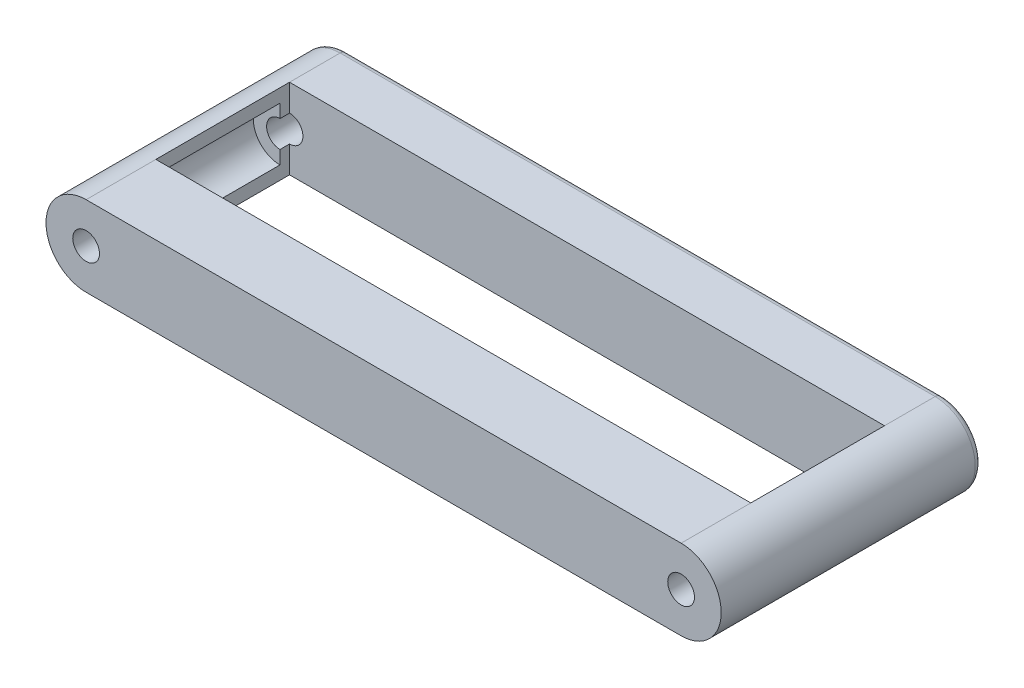
ISO-10303-21;
HEADER;
FILE_DESCRIPTION(('STEP AP214'),'2;1');
FILE_NAME('part.step','',(''),(''),'','','');
FILE_SCHEMA(('AUTOMOTIVE_DESIGN { 1 0 10303 214 1 1 1 1 }'));
ENDSEC;
DATA;
#1=APPLICATION_CONTEXT('core data for automotive mechanical design processes');
#2=APPLICATION_PROTOCOL_DEFINITION('international standard','automotive_design',2000,#1);
#3=PRODUCT_CONTEXT('',#1,'mechanical');
#4=PRODUCT('Part','Part','',(#3));
#5=PRODUCT_RELATED_PRODUCT_CATEGORY('part','',(#4));
#6=PRODUCT_DEFINITION_FORMATION('','',#4);
#7=PRODUCT_DEFINITION_CONTEXT('part definition',#1,'design');
#8=PRODUCT_DEFINITION('design','',#6,#7);
#9=PRODUCT_DEFINITION_SHAPE('','',#8);
#10=(LENGTH_UNIT() NAMED_UNIT(*) SI_UNIT(.MILLI.,.METRE.));
#11=(NAMED_UNIT(*) PLANE_ANGLE_UNIT() SI_UNIT($,.RADIAN.));
#12=(NAMED_UNIT(*) SI_UNIT($,.STERADIAN.) SOLID_ANGLE_UNIT());
#13=UNCERTAINTY_MEASURE_WITH_UNIT(LENGTH_MEASURE(1.E-05),#10,'distance_accuracy_value','');
#14=(GEOMETRIC_REPRESENTATION_CONTEXT(3) GLOBAL_UNCERTAINTY_ASSIGNED_CONTEXT((#13)) GLOBAL_UNIT_ASSIGNED_CONTEXT((#10,
#11,#12)) REPRESENTATION_CONTEXT('',''));
#15=CARTESIAN_POINT('',(0.,0.,0.));
#16=DIRECTION('',(0.,0.,1.));
#17=DIRECTION('',(1.,0.,0.));
#18=AXIS2_PLACEMENT_3D('',#15,#16,#17);
#19=CARTESIAN_POINT('',(-44.5,0.,39.));
#20=DIRECTION('',(0.,0.,-1.));
#21=DIRECTION('',(-1.,0.,0.));
#22=AXIS2_PLACEMENT_3D('',#19,#20,#21);
#23=CYLINDRICAL_SURFACE('',#22,2.);
#24=CARTESIAN_POINT('',(-44.5,0.,39.));
#25=DIRECTION('',(0.,0.,1.));
#26=DIRECTION('',(1.,0.,0.));
#27=AXIS2_PLACEMENT_3D('',#24,#25,#26);
#28=CIRCLE('',#27,2.);
#29=CARTESIAN_POINT('',(-42.5,0.,39.));
#30=VERTEX_POINT('',#29);
#31=EDGE_CURVE('E270',#30,#30,#28,.T.);
#32=ORIENTED_EDGE('',*,*,#31,.T.);
#33=EDGE_LOOP('',(#32));
#34=FACE_BOUND('',#33,.T.);
#35=CARTESIAN_POINT('',(-44.5,0.,34.));
#36=DIRECTION('',(0.,0.,-1.));
#37=DIRECTION('',(-1.,0.,0.));
#38=AXIS2_PLACEMENT_3D('',#35,#36,#37);
#39=CIRCLE('',#38,2.);
#40=CARTESIAN_POINT('',(-46.5,0.,34.));
#41=VERTEX_POINT('',#40);
#42=EDGE_CURVE('E220',#41,#41,#39,.T.);
#43=ORIENTED_EDGE('',*,*,#42,.T.);
#44=EDGE_LOOP('',(#43));
#45=FACE_BOUND('',#44,.T.);
#46=ADVANCED_FACE('F39',(#34,#45),#23,.F.);
#47=CARTESIAN_POINT('',(44.5,0.,39.));
#48=DIRECTION('',(0.,0.,-1.));
#49=DIRECTION('',(-1.,0.,0.));
#50=AXIS2_PLACEMENT_3D('',#47,#48,#49);
#51=CYLINDRICAL_SURFACE('',#50,2.);
#52=CARTESIAN_POINT('',(44.5,0.,1.));
#53=DIRECTION('',(0.,0.,1.));
#54=DIRECTION('',(1.,0.,0.));
#55=AXIS2_PLACEMENT_3D('',#52,#53,#54);
#56=CIRCLE('',#55,2.);
#57=CARTESIAN_POINT('',(46.5,0.,1.));
#58=VERTEX_POINT('',#57);
#59=EDGE_CURVE('E364',#58,#58,#56,.F.);
#60=ORIENTED_EDGE('',*,*,#59,.T.);
#61=EDGE_LOOP('',(#60));
#62=FACE_BOUND('',#61,.T.);
#63=DIRECTION('',(0.,0.,-1.));
#64=VECTOR('',#63,1.);
#65=CARTESIAN_POINT('',(44.5,-2.,39.));
#66=LINE('',#65,#64);
#67=CARTESIAN_POINT('',(44.5,-2.,10.));
#68=VERTEX_POINT('',#67);
#69=CARTESIAN_POINT('',(44.5,-2.,8.57164907619164));
#70=VERTEX_POINT('',#69);
#71=EDGE_CURVE('E311',#68,#70,#66,.T.);
#72=ORIENTED_EDGE('',*,*,#71,.F.);
#73=CARTESIAN_POINT('',(44.5,0.,10.));
#74=DIRECTION('',(0.,0.,1.));
#75=DIRECTION('',(1.,0.,0.));
#76=AXIS2_PLACEMENT_3D('',#73,#74,#75);
#77=CIRCLE('',#76,2.);
#78=CARTESIAN_POINT('',(44.5,2.,10.));
#79=VERTEX_POINT('',#78);
#80=EDGE_CURVE('E173',#68,#79,#77,.T.);
#81=ORIENTED_EDGE('',*,*,#80,.T.);
#82=DIRECTION('',(0.,0.,-1.));
#83=VECTOR('',#82,1.);
#84=CARTESIAN_POINT('',(44.5,2.,39.));
#85=LINE('',#84,#83);
#86=CARTESIAN_POINT('',(44.5,2.,8.57164907619164));
#87=VERTEX_POINT('',#86);
#88=EDGE_CURVE('E307',#87,#79,#85,.F.);
#89=ORIENTED_EDGE('',*,*,#88,.F.);
#90=CARTESIAN_POINT('',(44.5,0.,8.57164907619164));
#91=DIRECTION('',(0.,0.,-1.));
#92=DIRECTION('',(-1.,0.,0.));
#93=AXIS2_PLACEMENT_3D('',#90,#91,#92);
#94=CIRCLE('',#93,2.);
#95=EDGE_CURVE('E314',#70,#87,#94,.T.);
#96=ORIENTED_EDGE('',*,*,#95,.F.);
#97=EDGE_LOOP('',(#72,#81,#89,#96));
#98=FACE_BOUND('',#97,.T.);
#99=ADVANCED_FACE('F412',(#62,#98),#51,.F.);
#100=CARTESIAN_POINT('',(-44.5,-6.,39.));
#101=DIRECTION('',(0.,1.,0.));
#102=DIRECTION('',(0.,0.,1.));
#103=AXIS2_PLACEMENT_3D('',#100,#101,#102);
#104=PLANE('',#103);
#105=DIRECTION('',(0.,0.,-1.));
#106=VECTOR('',#105,1.);
#107=CARTESIAN_POINT('',(-44.5,-6.,39.));
#108=LINE('',#107,#106);
#109=CARTESIAN_POINT('',(-44.5,-6.,8.57164907619164));
#110=VERTEX_POINT('',#109);
#111=CARTESIAN_POINT('',(-44.5,-6.,1.));
#112=VERTEX_POINT('',#111);
#113=EDGE_CURVE('E302',#110,#112,#108,.T.);
#114=ORIENTED_EDGE('',*,*,#113,.T.);
#115=DIRECTION('',(1.,0.,0.));
#116=VECTOR('',#115,1.);
#117=CARTESIAN_POINT('',(-44.5,-6.,1.));
#118=LINE('',#117,#116);
#119=CARTESIAN_POINT('',(44.5,-6.,1.));
#120=VERTEX_POINT('',#119);
#121=EDGE_CURVE('E372',#112,#120,#118,.T.);
#122=ORIENTED_EDGE('',*,*,#121,.T.);
#123=DIRECTION('',(0.,0.,-1.));
#124=VECTOR('',#123,1.);
#125=CARTESIAN_POINT('',(44.5,-6.,39.));
#126=LINE('',#125,#124);
#127=CARTESIAN_POINT('',(44.5,-6.,8.57164907619164));
#128=VERTEX_POINT('',#127);
#129=EDGE_CURVE('E297',#128,#120,#126,.T.);
#130=ORIENTED_EDGE('',*,*,#129,.F.);
#131=DIRECTION('',(-1.,0.,0.));
#132=VECTOR('',#131,1.);
#133=CARTESIAN_POINT('',(-44.5,-6.,8.57164907619164));
#134=LINE('',#133,#132);
#135=EDGE_CURVE('E258',#128,#110,#134,.T.);
#136=ORIENTED_EDGE('',*,*,#135,.T.);
#137=EDGE_LOOP('',(#114,#122,#130,#136));
#138=FACE_BOUND('',#137,.T.);
#139=ADVANCED_FACE('F495',(#138),#104,.F.);
#140=CARTESIAN_POINT('',(-44.5,6.,39.));
#141=DIRECTION('',(0.,-1.,0.));
#142=DIRECTION('',(0.,0.,-1.));
#143=AXIS2_PLACEMENT_3D('',#140,#141,#142);
#144=PLANE('',#143);
#145=DIRECTION('',(0.,0.,-1.));
#146=VECTOR('',#145,1.);
#147=CARTESIAN_POINT('',(44.5,6.,39.));
#148=LINE('',#147,#146);
#149=CARTESIAN_POINT('',(44.5,6.,8.57164907619164));
#150=VERTEX_POINT('',#149);
#151=CARTESIAN_POINT('',(44.5,6.,1.));
#152=VERTEX_POINT('',#151);
#153=EDGE_CURVE('E292',#150,#152,#148,.T.);
#154=ORIENTED_EDGE('',*,*,#153,.T.);
#155=DIRECTION('',(-1.,0.,0.));
#156=VECTOR('',#155,1.);
#157=CARTESIAN_POINT('',(-44.5,6.,1.));
#158=LINE('',#157,#156);
#159=CARTESIAN_POINT('',(-44.5,6.,1.));
#160=VERTEX_POINT('',#159);
#161=EDGE_CURVE('E49',#152,#160,#158,.T.);
#162=ORIENTED_EDGE('',*,*,#161,.T.);
#163=DIRECTION('',(0.,0.,-1.));
#164=VECTOR('',#163,1.);
#165=CARTESIAN_POINT('',(-44.5,6.,39.));
#166=LINE('',#165,#164);
#167=CARTESIAN_POINT('',(-44.5,6.,8.57164907619164));
#168=VERTEX_POINT('',#167);
#169=EDGE_CURVE('E287',#168,#160,#166,.T.);
#170=ORIENTED_EDGE('',*,*,#169,.F.);
#171=DIRECTION('',(-1.,0.,0.));
#172=VECTOR('',#171,1.);
#173=CARTESIAN_POINT('',(-44.5,6.,8.57164907619164));
#174=LINE('',#173,#172);
#175=EDGE_CURVE('E228',#150,#168,#174,.T.);
#176=ORIENTED_EDGE('',*,*,#175,.F.);
#177=EDGE_LOOP('',(#154,#162,#170,#176));
#178=FACE_BOUND('',#177,.T.);
#179=ADVANCED_FACE('F509',(#178),#144,.F.);
#180=CARTESIAN_POINT('',(-44.5,0.,39.));
#181=DIRECTION('',(0.,0.,1.));
#182=DIRECTION('',(1.,0.,0.));
#183=AXIS2_PLACEMENT_3D('',#180,#181,#182);
#184=PLANE('',#183);
#185=ORIENTED_EDGE('',*,*,#31,.F.);
#186=EDGE_LOOP('',(#185));
#187=FACE_BOUND('',#186,.T.);
#188=CARTESIAN_POINT('',(-44.5,0.,39.));
#189=DIRECTION('',(0.,0.,1.));
#190=DIRECTION('',(1.,0.,0.));
#191=AXIS2_PLACEMENT_3D('',#188,#189,#190);
#192=CIRCLE('',#191,6.);
#193=CARTESIAN_POINT('',(-44.5,6.,39.));
#194=VERTEX_POINT('',#193);
#195=CARTESIAN_POINT('',(-44.5,-6.,39.));
#196=VERTEX_POINT('',#195);
#197=EDGE_CURVE('E274',#194,#196,#192,.T.);
#198=ORIENTED_EDGE('',*,*,#197,.T.);
#199=DIRECTION('',(1.,0.,0.));
#200=VECTOR('',#199,1.);
#201=CARTESIAN_POINT('',(-44.5,-6.,39.));
#202=LINE('',#201,#200);
#203=CARTESIAN_POINT('',(44.5,-6.,39.));
#204=VERTEX_POINT('',#203);
#205=EDGE_CURVE('E278',#196,#204,#202,.T.);
#206=ORIENTED_EDGE('',*,*,#205,.T.);
#207=CARTESIAN_POINT('',(44.5,0.,39.));
#208=DIRECTION('',(0.,0.,1.));
#209=DIRECTION('',(1.,0.,0.));
#210=AXIS2_PLACEMENT_3D('',#207,#208,#209);
#211=CIRCLE('',#210,6.);
#212=CARTESIAN_POINT('',(44.5,6.,39.));
#213=VERTEX_POINT('',#212);
#214=EDGE_CURVE('E281',#204,#213,#211,.T.);
#215=ORIENTED_EDGE('',*,*,#214,.T.);
#216=DIRECTION('',(-1.,0.,0.));
#217=VECTOR('',#216,1.);
#218=CARTESIAN_POINT('',(-44.5,6.,39.));
#219=LINE('',#218,#217);
#220=EDGE_CURVE('E284',#213,#194,#219,.T.);
#221=ORIENTED_EDGE('',*,*,#220,.T.);
#222=EDGE_LOOP('',(#198,#206,#215,#221));
#223=FACE_BOUND('',#222,.T.);
#224=CARTESIAN_POINT('',(44.5,0.,39.));
#225=DIRECTION('',(0.,0.,1.));
#226=DIRECTION('',(-1.,0.,0.));
#227=AXIS2_PLACEMENT_3D('',#224,#225,#226);
#228=CIRCLE('',#227,2.);
#229=CARTESIAN_POINT('',(42.5,0.,39.));
#230=VERTEX_POINT('',#229);
#231=EDGE_CURVE('E266',#230,#230,#228,.T.);
#232=ORIENTED_EDGE('',*,*,#231,.F.);
#233=EDGE_LOOP('',(#232));
#234=FACE_BOUND('',#233,.T.);
#235=ADVANCED_FACE('F450',(#187,#223,#234),#184,.T.);
#236=CARTESIAN_POINT('',(-44.5,0.,0.));
#237=DIRECTION('',(0.,0.,1.));
#238=DIRECTION('',(1.,0.,0.));
#239=AXIS2_PLACEMENT_3D('',#236,#237,#238);
#240=PLANE('',#239);
#241=CARTESIAN_POINT('',(44.5,0.,0.));
#242=DIRECTION('',(0.,0.,1.));
#243=DIRECTION('',(1.,0.,0.));
#244=AXIS2_PLACEMENT_3D('',#241,#242,#243);
#245=CIRCLE('',#244,3.);
#246=CARTESIAN_POINT('',(47.5,0.,0.));
#247=VERTEX_POINT('',#246);
#248=EDGE_CURVE('E360',#247,#247,#245,.T.);
#249=ORIENTED_EDGE('',*,*,#248,.T.);
#250=EDGE_LOOP('',(#249));
#251=FACE_BOUND('',#250,.T.);
#252=CARTESIAN_POINT('',(-44.5,0.,0.));
#253=DIRECTION('',(0.,0.,1.));
#254=DIRECTION('',(1.,0.,0.));
#255=AXIS2_PLACEMENT_3D('',#252,#253,#254);
#256=CIRCLE('',#255,3.);
#257=CARTESIAN_POINT('',(-41.5,0.,0.));
#258=VERTEX_POINT('',#257);
#259=EDGE_CURVE('E356',#258,#258,#256,.T.);
#260=ORIENTED_EDGE('',*,*,#259,.T.);
#261=EDGE_LOOP('',(#260));
#262=FACE_BOUND('',#261,.T.);
#263=CARTESIAN_POINT('',(44.5,0.,0.));
#264=DIRECTION('',(0.,0.,1.));
#265=DIRECTION('',(1.,0.,0.));
#266=AXIS2_PLACEMENT_3D('',#263,#264,#265);
#267=CIRCLE('',#266,5.);
#268=CARTESIAN_POINT('',(44.5,5.,0.));
#269=VERTEX_POINT('',#268);
#270=CARTESIAN_POINT('',(44.5,-5.,0.));
#271=VERTEX_POINT('',#270);
#272=EDGE_CURVE('E349',#269,#271,#267,.F.);
#273=ORIENTED_EDGE('',*,*,#272,.T.);
#274=DIRECTION('',(1.,0.,0.));
#275=VECTOR('',#274,1.);
#276=CARTESIAN_POINT('',(-44.5,-5.,0.));
#277=LINE('',#276,#275);
#278=CARTESIAN_POINT('',(-44.5,-5.,0.));
#279=VERTEX_POINT('',#278);
#280=EDGE_CURVE('E352',#271,#279,#277,.F.);
#281=ORIENTED_EDGE('',*,*,#280,.T.);
#282=CARTESIAN_POINT('',(-44.5,0.,0.));
#283=DIRECTION('',(0.,0.,1.));
#284=DIRECTION('',(1.,0.,0.));
#285=AXIS2_PLACEMENT_3D('',#282,#283,#284);
#286=CIRCLE('',#285,5.);
#287=CARTESIAN_POINT('',(-44.5,5.,0.));
#288=VERTEX_POINT('',#287);
#289=EDGE_CURVE('E337',#279,#288,#286,.F.);
#290=ORIENTED_EDGE('',*,*,#289,.T.);
#291=DIRECTION('',(-1.,0.,0.));
#292=VECTOR('',#291,1.);
#293=CARTESIAN_POINT('',(-44.5,5.,0.));
#294=LINE('',#293,#292);
#295=EDGE_CURVE('E346',#288,#269,#294,.F.);
#296=ORIENTED_EDGE('',*,*,#295,.T.);
#297=EDGE_LOOP('',(#273,#281,#290,#296));
#298=FACE_BOUND('',#297,.T.);
#299=ADVANCED_FACE('F518',(#251,#262,#298),#240,.F.);
#300=CARTESIAN_POINT('',(-44.5,0.,39.));
#301=DIRECTION('',(0.,0.,-1.));
#302=DIRECTION('',(-1.,0.,0.));
#303=AXIS2_PLACEMENT_3D('',#300,#301,#302);
#304=CYLINDRICAL_SURFACE('',#303,6.);
#305=ORIENTED_EDGE('',*,*,#169,.T.);
#306=CARTESIAN_POINT('',(-44.5,0.,1.));
#307=DIRECTION('',(0.,0.,1.));
#308=DIRECTION('',(1.,0.,0.));
#309=AXIS2_PLACEMENT_3D('',#306,#307,#308);
#310=CIRCLE('',#309,6.);
#311=EDGE_CURVE('E11',#160,#112,#310,.T.);
#312=ORIENTED_EDGE('',*,*,#311,.T.);
#313=ORIENTED_EDGE('',*,*,#113,.F.);
#314=DIRECTION('',(0.,0.,1.));
#315=VECTOR('',#314,1.);
#316=CARTESIAN_POINT('',(-44.5,-6.,39.));
#317=LINE('',#316,#315);
#318=CARTESIAN_POINT('',(-44.5,-6.,28.5716490761916));
#319=VERTEX_POINT('',#318);
#320=EDGE_CURVE('E262',#110,#319,#317,.T.);
#321=ORIENTED_EDGE('',*,*,#320,.T.);
#322=EDGE_CURVE('E303',#196,#319,#108,.T.);
#323=ORIENTED_EDGE('',*,*,#322,.F.);
#324=ORIENTED_EDGE('',*,*,#197,.F.);
#325=CARTESIAN_POINT('',(-44.5,6.,28.5716490761916));
#326=VERTEX_POINT('',#325);
#327=EDGE_CURVE('E288',#194,#326,#166,.T.);
#328=ORIENTED_EDGE('',*,*,#327,.T.);
#329=DIRECTION('',(0.,0.,1.));
#330=VECTOR('',#329,1.);
#331=CARTESIAN_POINT('',(-44.5,6.,8.57164907619164));
#332=LINE('',#331,#330);
#333=EDGE_CURVE('E215',#168,#326,#332,.T.);
#334=ORIENTED_EDGE('',*,*,#333,.F.);
#335=EDGE_LOOP('',(#305,#312,#313,#321,#323,#324,#328,#334));
#336=FACE_BOUND('',#335,.T.);
#337=ADVANCED_FACE('F442',(#336),#304,.T.);
#338=ORIENTED_EDGE('',*,*,#322,.T.);
#339=DIRECTION('',(1.,0.,0.));
#340=VECTOR('',#339,1.);
#341=CARTESIAN_POINT('',(-44.5,-6.,28.5716490761916));
#342=LINE('',#341,#340);
#343=CARTESIAN_POINT('',(44.5,-6.,28.5716490761916));
#344=VERTEX_POINT('',#343);
#345=EDGE_CURVE('E247',#319,#344,#342,.T.);
#346=ORIENTED_EDGE('',*,*,#345,.T.);
#347=EDGE_CURVE('E298',#204,#344,#126,.T.);
#348=ORIENTED_EDGE('',*,*,#347,.F.);
#349=ORIENTED_EDGE('',*,*,#205,.F.);
#350=EDGE_LOOP('',(#338,#346,#348,#349));
#351=FACE_BOUND('',#350,.T.);
#352=ADVANCED_FACE('F446',(#351),#104,.F.);
#353=CARTESIAN_POINT('',(44.5,0.,39.));
#354=DIRECTION('',(0.,0.,-1.));
#355=DIRECTION('',(-1.,0.,0.));
#356=AXIS2_PLACEMENT_3D('',#353,#354,#355);
#357=CYLINDRICAL_SURFACE('',#356,6.);
#358=ORIENTED_EDGE('',*,*,#129,.T.);
#359=CARTESIAN_POINT('',(44.5,0.,1.));
#360=DIRECTION('',(0.,0.,1.));
#361=DIRECTION('',(1.,0.,0.));
#362=AXIS2_PLACEMENT_3D('',#359,#360,#361);
#363=CIRCLE('',#362,6.);
#364=EDGE_CURVE('E64',#120,#152,#363,.T.);
#365=ORIENTED_EDGE('',*,*,#364,.T.);
#366=ORIENTED_EDGE('',*,*,#153,.F.);
#367=DIRECTION('',(0.,0.,-1.));
#368=VECTOR('',#367,1.);
#369=CARTESIAN_POINT('',(44.5,6.,8.57164907619164));
#370=LINE('',#369,#368);
#371=CARTESIAN_POINT('',(44.5,6.,28.5716490761916));
#372=VERTEX_POINT('',#371);
#373=EDGE_CURVE('E224',#372,#150,#370,.T.);
#374=ORIENTED_EDGE('',*,*,#373,.F.);
#375=EDGE_CURVE('E293',#213,#372,#148,.T.);
#376=ORIENTED_EDGE('',*,*,#375,.F.);
#377=ORIENTED_EDGE('',*,*,#214,.F.);
#378=ORIENTED_EDGE('',*,*,#347,.T.);
#379=DIRECTION('',(0.,0.,-1.));
#380=VECTOR('',#379,1.);
#381=CARTESIAN_POINT('',(44.5,-6.,39.));
#382=LINE('',#381,#380);
#383=EDGE_CURVE('E251',#344,#128,#382,.T.);
#384=ORIENTED_EDGE('',*,*,#383,.T.);
#385=EDGE_LOOP('',(#358,#365,#366,#374,#376,#377,#378,#384));
#386=FACE_BOUND('',#385,.T.);
#387=ADVANCED_FACE('F459',(#386),#357,.T.);
#388=ORIENTED_EDGE('',*,*,#375,.T.);
#389=DIRECTION('',(1.,0.,0.));
#390=VECTOR('',#389,1.);
#391=CARTESIAN_POINT('',(-44.5,6.,28.5716490761916));
#392=LINE('',#391,#390);
#393=EDGE_CURVE('E219',#326,#372,#392,.T.);
#394=ORIENTED_EDGE('',*,*,#393,.F.);
#395=ORIENTED_EDGE('',*,*,#327,.F.);
#396=ORIENTED_EDGE('',*,*,#220,.F.);
#397=EDGE_LOOP('',(#388,#394,#395,#396));
#398=FACE_BOUND('',#397,.T.);
#399=ADVANCED_FACE('F457',(#398),#144,.F.);
#400=CARTESIAN_POINT('',(-44.5,0.,1.));
#401=DIRECTION('',(0.,0.,1.));
#402=DIRECTION('',(1.,0.,0.));
#403=AXIS2_PLACEMENT_3D('',#400,#401,#402);
#404=CIRCLE('',#403,2.);
#405=CARTESIAN_POINT('',(-42.5,0.,1.));
#406=VERTEX_POINT('',#405);
#407=EDGE_CURVE('E368',#406,#406,#404,.F.);
#408=ORIENTED_EDGE('',*,*,#407,.T.);
#409=EDGE_LOOP('',(#408));
#410=FACE_BOUND('',#409,.T.);
#411=CARTESIAN_POINT('',(-44.5,0.,10.));
#412=DIRECTION('',(0.,0.,-1.));
#413=DIRECTION('',(-1.,0.,0.));
#414=AXIS2_PLACEMENT_3D('',#411,#412,#413);
#415=CIRCLE('',#414,2.);
#416=CARTESIAN_POINT('',(-44.5,-2.,10.));
#417=VERTEX_POINT('',#416);
#418=CARTESIAN_POINT('',(-44.5,2.,10.));
#419=VERTEX_POINT('',#418);
#420=EDGE_CURVE('E207',#417,#419,#415,.T.);
#421=ORIENTED_EDGE('',*,*,#420,.F.);
#422=DIRECTION('',(0.,0.,-1.));
#423=VECTOR('',#422,1.);
#424=CARTESIAN_POINT('',(-44.5,-2.,39.));
#425=LINE('',#424,#423);
#426=CARTESIAN_POINT('',(-44.5,-2.,8.57164907619164));
#427=VERTEX_POINT('',#426);
#428=EDGE_CURVE('E317',#427,#417,#425,.F.);
#429=ORIENTED_EDGE('',*,*,#428,.F.);
#430=CARTESIAN_POINT('',(-44.5,0.,8.57164907619164));
#431=DIRECTION('',(0.,0.,-1.));
#432=DIRECTION('',(-1.,0.,0.));
#433=AXIS2_PLACEMENT_3D('',#430,#431,#432);
#434=CIRCLE('',#433,2.);
#435=CARTESIAN_POINT('',(-44.5,2.,8.57164907619164));
#436=VERTEX_POINT('',#435);
#437=EDGE_CURVE('E255',#436,#427,#434,.T.);
#438=ORIENTED_EDGE('',*,*,#437,.F.);
#439=DIRECTION('',(0.,0.,-1.));
#440=VECTOR('',#439,1.);
#441=CARTESIAN_POINT('',(-44.5,2.,39.));
#442=LINE('',#441,#440);
#443=EDGE_CURVE('E321',#419,#436,#442,.T.);
#444=ORIENTED_EDGE('',*,*,#443,.F.);
#445=EDGE_LOOP('',(#421,#429,#438,#444));
#446=FACE_BOUND('',#445,.T.);
#447=ADVANCED_FACE('F467',(#410,#446),#23,.F.);
#448=CARTESIAN_POINT('',(44.5,0.,34.));
#449=DIRECTION('',(0.,0.,1.));
#450=DIRECTION('',(1.,0.,0.));
#451=AXIS2_PLACEMENT_3D('',#448,#449,#450);
#452=CIRCLE('',#451,2.);
#453=CARTESIAN_POINT('',(46.5,0.,34.));
#454=VERTEX_POINT('',#453);
#455=EDGE_CURVE('E214',#454,#454,#452,.T.);
#456=ORIENTED_EDGE('',*,*,#455,.F.);
#457=EDGE_LOOP('',(#456));
#458=FACE_BOUND('',#457,.T.);
#459=ORIENTED_EDGE('',*,*,#231,.T.);
#460=EDGE_LOOP('',(#459));
#461=FACE_BOUND('',#460,.T.);
#462=ADVANCED_FACE('F498',(#458,#461),#51,.F.);
#463=CARTESIAN_POINT('',(-44.5,-33.,8.57164907619164));
#464=DIRECTION('',(-1.,0.,0.));
#465=DIRECTION('',(0.,0.,1.));
#466=AXIS2_PLACEMENT_3D('',#463,#464,#465);
#467=PLANE('',#466);
#468=DIRECTION('',(0.,-1.,0.));
#469=VECTOR('',#468,1.);
#470=CARTESIAN_POINT('',(-44.5,-33.,10.));
#471=LINE('',#470,#469);
#472=CARTESIAN_POINT('',(-44.5,-4.00000000000001,10.));
#473=VERTEX_POINT('',#472);
#474=EDGE_CURVE('E210',#417,#473,#471,.T.);
#475=ORIENTED_EDGE('',*,*,#474,.T.);
#476=DIRECTION('',(0.,0.,1.));
#477=VECTOR('',#476,1.);
#478=CARTESIAN_POINT('',(-44.5,-4.00000000000001,10.));
#479=LINE('',#478,#477);
#480=CARTESIAN_POINT('',(-44.5,-4.00000000000001,28.5716490761916));
#481=VERTEX_POINT('',#480);
#482=EDGE_CURVE('E200',#473,#481,#479,.T.);
#483=ORIENTED_EDGE('',*,*,#482,.T.);
#484=DIRECTION('',(0.,1.,0.));
#485=VECTOR('',#484,1.);
#486=CARTESIAN_POINT('',(-44.5,-33.,28.5716490761916));
#487=LINE('',#486,#485);
#488=EDGE_CURVE('E244',#319,#481,#487,.T.);
#489=ORIENTED_EDGE('',*,*,#488,.F.);
#490=ORIENTED_EDGE('',*,*,#320,.F.);
#491=DIRECTION('',(0.,1.,0.));
#492=VECTOR('',#491,1.);
#493=CARTESIAN_POINT('',(-44.5,-33.,8.57164907619164));
#494=LINE('',#493,#492);
#495=EDGE_CURVE('E236',#110,#427,#494,.T.);
#496=ORIENTED_EDGE('',*,*,#495,.T.);
#497=ORIENTED_EDGE('',*,*,#428,.T.);
#498=EDGE_LOOP('',(#475,#483,#489,#490,#496,#497));
#499=FACE_BOUND('',#498,.T.);
#500=ADVANCED_FACE('F437',(#499),#467,.F.);
#501=CARTESIAN_POINT('',(-44.5,4.00000000000001,28.5716490761916));
#502=VERTEX_POINT('',#501);
#503=EDGE_CURVE('E232',#502,#326,#487,.T.);
#504=ORIENTED_EDGE('',*,*,#503,.F.);
#505=DIRECTION('',(0.,0.,1.));
#506=VECTOR('',#505,1.);
#507=CARTESIAN_POINT('',(-44.5,4.00000000000001,10.));
#508=LINE('',#507,#506);
#509=CARTESIAN_POINT('',(-44.5,4.00000000000001,10.));
#510=VERTEX_POINT('',#509);
#511=EDGE_CURVE('E195',#502,#510,#508,.F.);
#512=ORIENTED_EDGE('',*,*,#511,.T.);
#513=DIRECTION('',(0.,-1.,0.));
#514=VECTOR('',#513,1.);
#515=CARTESIAN_POINT('',(-44.5,-33.,10.));
#516=LINE('',#515,#514);
#517=EDGE_CURVE('E333',#510,#419,#516,.T.);
#518=ORIENTED_EDGE('',*,*,#517,.T.);
#519=ORIENTED_EDGE('',*,*,#443,.T.);
#520=EDGE_CURVE('E233',#436,#168,#494,.T.);
#521=ORIENTED_EDGE('',*,*,#520,.T.);
#522=ORIENTED_EDGE('',*,*,#333,.T.);
#523=EDGE_LOOP('',(#504,#512,#518,#519,#521,#522));
#524=FACE_BOUND('',#523,.T.);
#525=ADVANCED_FACE('F473',(#524),#467,.F.);
#526=CARTESIAN_POINT('',(-44.5,-33.,8.57164907619164));
#527=DIRECTION('',(0.,0.,-1.));
#528=DIRECTION('',(-1.,0.,0.));
#529=AXIS2_PLACEMENT_3D('',#526,#527,#528);
#530=PLANE('',#529);
#531=DIRECTION('',(0.,1.,0.));
#532=VECTOR('',#531,1.);
#533=CARTESIAN_POINT('',(44.5,-33.,8.57164907619164));
#534=LINE('',#533,#532);
#535=EDGE_CURVE('E237',#128,#70,#534,.T.);
#536=ORIENTED_EDGE('',*,*,#535,.T.);
#537=ORIENTED_EDGE('',*,*,#95,.T.);
#538=EDGE_CURVE('E238',#87,#150,#534,.T.);
#539=ORIENTED_EDGE('',*,*,#538,.T.);
#540=ORIENTED_EDGE('',*,*,#175,.T.);
#541=ORIENTED_EDGE('',*,*,#520,.F.);
#542=ORIENTED_EDGE('',*,*,#437,.T.);
#543=ORIENTED_EDGE('',*,*,#495,.F.);
#544=ORIENTED_EDGE('',*,*,#135,.F.);
#545=EDGE_LOOP('',(#536,#537,#539,#540,#541,#542,#543,#544));
#546=FACE_BOUND('',#545,.T.);
#547=ADVANCED_FACE('F421',(#546),#530,.F.);
#548=CARTESIAN_POINT('',(44.5,-33.,8.57164907619164));
#549=DIRECTION('',(1.,0.,0.));
#550=DIRECTION('',(0.,0.,-1.));
#551=AXIS2_PLACEMENT_3D('',#548,#549,#550);
#552=PLANE('',#551);
#553=DIRECTION('',(0.,1.,0.));
#554=VECTOR('',#553,1.);
#555=CARTESIAN_POINT('',(44.5,-33.,28.5716490761916));
#556=LINE('',#555,#554);
#557=CARTESIAN_POINT('',(44.5,-4.00000000000001,28.5716490761916));
#558=VERTEX_POINT('',#557);
#559=EDGE_CURVE('E193',#344,#558,#556,.T.);
#560=ORIENTED_EDGE('',*,*,#559,.T.);
#561=DIRECTION('',(0.,0.,1.));
#562=VECTOR('',#561,1.);
#563=CARTESIAN_POINT('',(44.5,-4.00000000000001,10.));
#564=LINE('',#563,#562);
#565=CARTESIAN_POINT('',(44.5,-4.00000000000001,10.));
#566=VERTEX_POINT('',#565);
#567=EDGE_CURVE('E182',#558,#566,#564,.F.);
#568=ORIENTED_EDGE('',*,*,#567,.T.);
#569=DIRECTION('',(0.,-1.,0.));
#570=VECTOR('',#569,1.);
#571=CARTESIAN_POINT('',(44.5,-33.,10.));
#572=LINE('',#571,#570);
#573=EDGE_CURVE('E167',#68,#566,#572,.T.);
#574=ORIENTED_EDGE('',*,*,#573,.F.);
#575=ORIENTED_EDGE('',*,*,#71,.T.);
#576=ORIENTED_EDGE('',*,*,#535,.F.);
#577=ORIENTED_EDGE('',*,*,#383,.F.);
#578=EDGE_LOOP('',(#560,#568,#574,#575,#576,#577));
#579=FACE_BOUND('',#578,.T.);
#580=ADVANCED_FACE('F191',(#579),#552,.F.);
#581=CARTESIAN_POINT('',(-44.5,-33.,28.5716490761916));
#582=DIRECTION('',(0.,0.,1.));
#583=DIRECTION('',(1.,0.,0.));
#584=AXIS2_PLACEMENT_3D('',#581,#582,#583);
#585=PLANE('',#584);
#586=CARTESIAN_POINT('',(44.5,4.00000000000001,28.5716490761916));
#587=VERTEX_POINT('',#586);
#588=EDGE_CURVE('E241',#587,#372,#556,.T.);
#589=ORIENTED_EDGE('',*,*,#588,.F.);
#590=CARTESIAN_POINT('',(44.5,0.,28.5716490761916));
#591=DIRECTION('',(0.,0.,1.));
#592=DIRECTION('',(1.,0.,0.));
#593=AXIS2_PLACEMENT_3D('',#590,#591,#592);
#594=CIRCLE('',#593,4.00000000000001);
#595=EDGE_CURVE('E178',#587,#558,#594,.T.);
#596=ORIENTED_EDGE('',*,*,#595,.T.);
#597=ORIENTED_EDGE('',*,*,#559,.F.);
#598=ORIENTED_EDGE('',*,*,#345,.F.);
#599=ORIENTED_EDGE('',*,*,#488,.T.);
#600=CARTESIAN_POINT('',(-44.5,0.,28.5716490761916));
#601=DIRECTION('',(0.,0.,1.));
#602=DIRECTION('',(1.,0.,0.));
#603=AXIS2_PLACEMENT_3D('',#600,#601,#602);
#604=CIRCLE('',#603,4.00000000000001);
#605=EDGE_CURVE('E329',#481,#502,#604,.T.);
#606=ORIENTED_EDGE('',*,*,#605,.T.);
#607=ORIENTED_EDGE('',*,*,#503,.T.);
#608=ORIENTED_EDGE('',*,*,#393,.T.);
#609=EDGE_LOOP('',(#589,#596,#597,#598,#599,#606,#607,#608));
#610=FACE_BOUND('',#609,.T.);
#611=ADVANCED_FACE('F434',(#610),#585,.F.);
#612=DIRECTION('',(0.,-1.,0.));
#613=VECTOR('',#612,1.);
#614=CARTESIAN_POINT('',(44.5,-33.,10.));
#615=LINE('',#614,#613);
#616=CARTESIAN_POINT('',(44.5,4.,10.));
#617=VERTEX_POINT('',#616);
#618=EDGE_CURVE('E324',#617,#79,#615,.T.);
#619=ORIENTED_EDGE('',*,*,#618,.F.);
#620=DIRECTION('',(0.,0.,1.));
#621=VECTOR('',#620,1.);
#622=CARTESIAN_POINT('',(44.5,4.00000000000001,10.));
#623=LINE('',#622,#621);
#624=EDGE_CURVE('E185',#617,#587,#623,.T.);
#625=ORIENTED_EDGE('',*,*,#624,.T.);
#626=ORIENTED_EDGE('',*,*,#588,.T.);
#627=ORIENTED_EDGE('',*,*,#373,.T.);
#628=ORIENTED_EDGE('',*,*,#538,.F.);
#629=ORIENTED_EDGE('',*,*,#88,.T.);
#630=EDGE_LOOP('',(#619,#625,#626,#627,#628,#629));
#631=FACE_BOUND('',#630,.T.);
#632=ADVANCED_FACE('F416',(#631),#552,.F.);
#633=CARTESIAN_POINT('',(44.5,0.,10.));
#634=DIRECTION('',(0.,0.,1.));
#635=DIRECTION('',(1.,0.,0.));
#636=AXIS2_PLACEMENT_3D('',#633,#634,#635);
#637=CYLINDRICAL_SURFACE('',#636,4.00000000000001);
#638=CARTESIAN_POINT('',(44.5,0.,34.));
#639=DIRECTION('',(0.,0.,1.));
#640=DIRECTION('',(1.,0.,0.));
#641=AXIS2_PLACEMENT_3D('',#638,#639,#640);
#642=CIRCLE('',#641,4.00000000000001);
#643=CARTESIAN_POINT('',(48.5,0.,34.));
#644=VERTEX_POINT('',#643);
#645=EDGE_CURVE('E188',#644,#644,#642,.T.);
#646=ORIENTED_EDGE('',*,*,#645,.T.);
#647=EDGE_LOOP('',(#646));
#648=FACE_BOUND('',#647,.T.);
#649=ORIENTED_EDGE('',*,*,#595,.F.);
#650=ORIENTED_EDGE('',*,*,#624,.F.);
#651=CARTESIAN_POINT('',(44.5,0.,10.));
#652=DIRECTION('',(0.,0.,1.));
#653=DIRECTION('',(1.,0.,0.));
#654=AXIS2_PLACEMENT_3D('',#651,#652,#653);
#655=CIRCLE('',#654,4.00000000000001);
#656=EDGE_CURVE('E170',#566,#617,#655,.T.);
#657=ORIENTED_EDGE('',*,*,#656,.F.);
#658=ORIENTED_EDGE('',*,*,#567,.F.);
#659=EDGE_LOOP('',(#649,#650,#657,#658));
#660=FACE_BOUND('',#659,.T.);
#661=ADVANCED_FACE('F181',(#648,#660),#637,.F.);
#662=CARTESIAN_POINT('',(44.5,0.,10.));
#663=DIRECTION('',(0.,0.,1.));
#664=DIRECTION('',(1.,0.,0.));
#665=AXIS2_PLACEMENT_3D('',#662,#663,#664);
#666=PLANE('',#665);
#667=ORIENTED_EDGE('',*,*,#573,.T.);
#668=ORIENTED_EDGE('',*,*,#656,.T.);
#669=ORIENTED_EDGE('',*,*,#618,.T.);
#670=ORIENTED_EDGE('',*,*,#80,.F.);
#671=EDGE_LOOP('',(#667,#668,#669,#670));
#672=FACE_BOUND('',#671,.T.);
#673=ADVANCED_FACE('F169',(#672),#666,.T.);
#674=CARTESIAN_POINT('',(44.5,0.,34.));
#675=DIRECTION('',(0.,0.,1.));
#676=DIRECTION('',(1.,0.,0.));
#677=AXIS2_PLACEMENT_3D('',#674,#675,#676);
#678=PLANE('',#677);
#679=ORIENTED_EDGE('',*,*,#455,.T.);
#680=EDGE_LOOP('',(#679));
#681=FACE_BOUND('',#680,.T.);
#682=ORIENTED_EDGE('',*,*,#645,.F.);
#683=EDGE_LOOP('',(#682));
#684=FACE_BOUND('',#683,.T.);
#685=ADVANCED_FACE('F486',(#681,#684),#678,.F.);
#686=CARTESIAN_POINT('',(-44.5,0.,10.));
#687=DIRECTION('',(0.,0.,-1.));
#688=DIRECTION('',(-1.,0.,0.));
#689=AXIS2_PLACEMENT_3D('',#686,#687,#688);
#690=PLANE('',#689);
#691=ORIENTED_EDGE('',*,*,#420,.T.);
#692=ORIENTED_EDGE('',*,*,#517,.F.);
#693=CARTESIAN_POINT('',(-44.5,0.,10.));
#694=DIRECTION('',(0.,0.,1.));
#695=DIRECTION('',(-1.,0.,0.));
#696=AXIS2_PLACEMENT_3D('',#693,#694,#695);
#697=CIRCLE('',#696,4.00000000000001);
#698=EDGE_CURVE('E400',#510,#473,#697,.T.);
#699=ORIENTED_EDGE('',*,*,#698,.T.);
#700=ORIENTED_EDGE('',*,*,#474,.F.);
#701=EDGE_LOOP('',(#691,#692,#699,#700));
#702=FACE_BOUND('',#701,.T.);
#703=ADVANCED_FACE('F470',(#702),#690,.F.);
#704=CARTESIAN_POINT('',(-44.5,0.,10.));
#705=DIRECTION('',(0.,0.,1.));
#706=DIRECTION('',(1.,0.,0.));
#707=AXIS2_PLACEMENT_3D('',#704,#705,#706);
#708=CYLINDRICAL_SURFACE('',#707,4.00000000000001);
#709=CARTESIAN_POINT('',(-44.5,0.,34.));
#710=DIRECTION('',(0.,0.,1.));
#711=DIRECTION('',(-1.,0.,0.));
#712=AXIS2_PLACEMENT_3D('',#709,#710,#711);
#713=CIRCLE('',#712,4.00000000000001);
#714=CARTESIAN_POINT('',(-48.5,0.,34.));
#715=VERTEX_POINT('',#714);
#716=EDGE_CURVE('E393',#715,#715,#713,.T.);
#717=ORIENTED_EDGE('',*,*,#716,.T.);
#718=EDGE_LOOP('',(#717));
#719=FACE_BOUND('',#718,.T.);
#720=ORIENTED_EDGE('',*,*,#698,.F.);
#721=ORIENTED_EDGE('',*,*,#511,.F.);
#722=ORIENTED_EDGE('',*,*,#605,.F.);
#723=ORIENTED_EDGE('',*,*,#482,.F.);
#724=EDGE_LOOP('',(#720,#721,#722,#723));
#725=FACE_BOUND('',#724,.T.);
#726=ADVANCED_FACE('F475',(#719,#725),#708,.F.);
#727=CARTESIAN_POINT('',(-44.5,0.,34.));
#728=DIRECTION('',(0.,0.,-1.));
#729=DIRECTION('',(-1.,0.,0.));
#730=AXIS2_PLACEMENT_3D('',#727,#728,#729);
#731=PLANE('',#730);
#732=ORIENTED_EDGE('',*,*,#42,.F.);
#733=EDGE_LOOP('',(#732));
#734=FACE_BOUND('',#733,.T.);
#735=ORIENTED_EDGE('',*,*,#716,.F.);
#736=EDGE_LOOP('',(#735));
#737=FACE_BOUND('',#736,.T.);
#738=ADVANCED_FACE('F477',(#734,#737),#731,.T.);
#739=CARTESIAN_POINT('',(44.5,0.,1.));
#740=DIRECTION('',(0.,0.,1.));
#741=DIRECTION('',(1.,0.,0.));
#742=AXIS2_PLACEMENT_3D('',#739,#740,#741);
#743=TOROIDAL_SURFACE('',#742,3.,1.);
#744=ORIENTED_EDGE('',*,*,#59,.F.);
#745=EDGE_LOOP('',(#744));
#746=FACE_BOUND('',#745,.T.);
#747=ORIENTED_EDGE('',*,*,#248,.F.);
#748=EDGE_LOOP('',(#747));
#749=FACE_BOUND('',#748,.T.);
#750=ADVANCED_FACE('F483',(#746,#749),#743,.T.);
#751=CARTESIAN_POINT('',(-44.5,0.,1.));
#752=DIRECTION('',(0.,0.,1.));
#753=DIRECTION('',(1.,0.,0.));
#754=AXIS2_PLACEMENT_3D('',#751,#752,#753);
#755=TOROIDAL_SURFACE('',#754,3.,1.);
#756=ORIENTED_EDGE('',*,*,#407,.F.);
#757=EDGE_LOOP('',(#756));
#758=FACE_BOUND('',#757,.T.);
#759=ORIENTED_EDGE('',*,*,#259,.F.);
#760=EDGE_LOOP('',(#759));
#761=FACE_BOUND('',#760,.T.);
#762=ADVANCED_FACE('F512',(#758,#761),#755,.T.);
#763=CARTESIAN_POINT('',(-44.5,5.,1.));
#764=DIRECTION('',(-1.,0.,0.));
#765=DIRECTION('',(0.,0.,1.));
#766=AXIS2_PLACEMENT_3D('',#763,#764,#765);
#767=CYLINDRICAL_SURFACE('',#766,1.);
#768=CARTESIAN_POINT('',(44.5,5.,1.));
#769=DIRECTION('',(1.,0.,0.));
#770=DIRECTION('',(0.,0.,-1.));
#771=AXIS2_PLACEMENT_3D('',#768,#769,#770);
#772=CIRCLE('',#771,1.);
#773=EDGE_CURVE('E385',#269,#152,#772,.T.);
#774=ORIENTED_EDGE('',*,*,#773,.F.);
#775=ORIENTED_EDGE('',*,*,#295,.F.);
#776=CARTESIAN_POINT('',(-44.5,5.,1.));
#777=DIRECTION('',(-1.,0.,0.));
#778=DIRECTION('',(0.,0.,1.));
#779=AXIS2_PLACEMENT_3D('',#776,#777,#778);
#780=CIRCLE('',#779,1.);
#781=EDGE_CURVE('E43',#160,#288,#780,.T.);
#782=ORIENTED_EDGE('',*,*,#781,.F.);
#783=ORIENTED_EDGE('',*,*,#161,.F.);
#784=EDGE_LOOP('',(#774,#775,#782,#783));
#785=FACE_BOUND('',#784,.T.);
#786=ADVANCED_FACE('F41',(#785),#767,.T.);
#787=CARTESIAN_POINT('',(-44.5,0.,1.));
#788=DIRECTION('',(0.,0.,1.));
#789=DIRECTION('',(1.,0.,0.));
#790=AXIS2_PLACEMENT_3D('',#787,#788,#789);
#791=TOROIDAL_SURFACE('',#790,5.,1.);
#792=ORIENTED_EDGE('',*,*,#781,.T.);
#793=ORIENTED_EDGE('',*,*,#289,.F.);
#794=CARTESIAN_POINT('',(-44.5,-5.,1.));
#795=DIRECTION('',(1.,0.,0.));
#796=DIRECTION('',(0.,0.,-1.));
#797=AXIS2_PLACEMENT_3D('',#794,#795,#796);
#798=CIRCLE('',#797,1.);
#799=EDGE_CURVE('E383',#112,#279,#798,.T.);
#800=ORIENTED_EDGE('',*,*,#799,.F.);
#801=ORIENTED_EDGE('',*,*,#311,.F.);
#802=EDGE_LOOP('',(#792,#793,#800,#801));
#803=FACE_BOUND('',#802,.T.);
#804=ADVANCED_FACE('F533',(#803),#791,.T.);
#805=CARTESIAN_POINT('',(44.5,0.,1.));
#806=DIRECTION('',(0.,0.,1.));
#807=DIRECTION('',(1.,0.,0.));
#808=AXIS2_PLACEMENT_3D('',#805,#806,#807);
#809=TOROIDAL_SURFACE('',#808,5.,1.);
#810=ORIENTED_EDGE('',*,*,#773,.T.);
#811=ORIENTED_EDGE('',*,*,#364,.F.);
#812=CARTESIAN_POINT('',(44.5,-5.,1.));
#813=DIRECTION('',(-1.,0.,0.));
#814=DIRECTION('',(0.,0.,1.));
#815=AXIS2_PLACEMENT_3D('',#812,#813,#814);
#816=CIRCLE('',#815,1.);
#817=EDGE_CURVE('E380',#271,#120,#816,.T.);
#818=ORIENTED_EDGE('',*,*,#817,.F.);
#819=ORIENTED_EDGE('',*,*,#272,.F.);
#820=EDGE_LOOP('',(#810,#811,#818,#819));
#821=FACE_BOUND('',#820,.T.);
#822=ADVANCED_FACE('F530',(#821),#809,.T.);
#823=CARTESIAN_POINT('',(-44.5,-5.,1.));
#824=DIRECTION('',(1.,0.,0.));
#825=DIRECTION('',(0.,0.,-1.));
#826=AXIS2_PLACEMENT_3D('',#823,#824,#825);
#827=CYLINDRICAL_SURFACE('',#826,1.);
#828=ORIENTED_EDGE('',*,*,#799,.T.);
#829=ORIENTED_EDGE('',*,*,#280,.F.);
#830=ORIENTED_EDGE('',*,*,#817,.T.);
#831=ORIENTED_EDGE('',*,*,#121,.F.);
#832=EDGE_LOOP('',(#828,#829,#830,#831));
#833=FACE_BOUND('',#832,.T.);
#834=ADVANCED_FACE('F527',(#833),#827,.T.);
#835=CLOSED_SHELL('',(#46,#99,#139,#179,#235,#299,#337,#352,#387,#399,#447,#462,#500,#525,#547,
#580,#611,#632,#661,#673,#685,#703,#726,#738,#750,#762,#786,#804,#822,#834));
#836=MANIFOLD_SOLID_BREP('B2',#835);
#837=ADVANCED_BREP_SHAPE_REPRESENTATION('',(#18,#836),#14);
#838=SHAPE_DEFINITION_REPRESENTATION(#9,#837);
ENDSEC;
END-ISO-10303-21;
